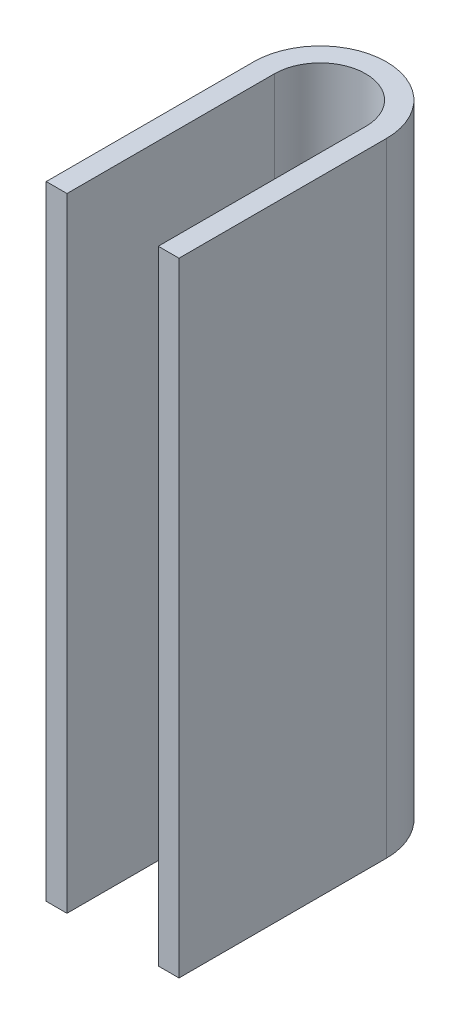
ISO-10303-21;
HEADER;
FILE_DESCRIPTION(('STEP AP214'),'2;1');
FILE_NAME('part.step','',(''),(''),'','','');
FILE_SCHEMA(('AUTOMOTIVE_DESIGN { 1 0 10303 214 1 1 1 1 }'));
ENDSEC;
DATA;
#1=APPLICATION_CONTEXT('core data for automotive mechanical design processes');
#2=APPLICATION_PROTOCOL_DEFINITION('international standard','automotive_design',2000,#1);
#3=PRODUCT_CONTEXT('',#1,'mechanical');
#4=PRODUCT('Part','Part','',(#3));
#5=PRODUCT_RELATED_PRODUCT_CATEGORY('part','',(#4));
#6=PRODUCT_DEFINITION_FORMATION('','',#4);
#7=PRODUCT_DEFINITION_CONTEXT('part definition',#1,'design');
#8=PRODUCT_DEFINITION('design','',#6,#7);
#9=PRODUCT_DEFINITION_SHAPE('','',#8);
#10=(LENGTH_UNIT() NAMED_UNIT(*) SI_UNIT(.MILLI.,.METRE.));
#11=(NAMED_UNIT(*) PLANE_ANGLE_UNIT() SI_UNIT($,.RADIAN.));
#12=(NAMED_UNIT(*) SI_UNIT($,.STERADIAN.) SOLID_ANGLE_UNIT());
#13=UNCERTAINTY_MEASURE_WITH_UNIT(LENGTH_MEASURE(1.E-05),#10,'distance_accuracy_value','');
#14=(GEOMETRIC_REPRESENTATION_CONTEXT(3) GLOBAL_UNCERTAINTY_ASSIGNED_CONTEXT((#13)) GLOBAL_UNIT_ASSIGNED_CONTEXT((#10,
#11,#12)) REPRESENTATION_CONTEXT('',''));
#15=CARTESIAN_POINT('',(0.,0.,0.));
#16=DIRECTION('',(0.,0.,1.));
#17=DIRECTION('',(1.,0.,0.));
#18=AXIS2_PLACEMENT_3D('',#15,#16,#17);
#19=CARTESIAN_POINT('',(22.,300.5,0.));
#20=DIRECTION('',(0.,-1.,0.));
#21=DIRECTION('',(0.,0.,-1.));
#22=AXIS2_PLACEMENT_3D('',#19,#20,#21);
#23=CYLINDRICAL_SURFACE('',#22,22.);
#24=CARTESIAN_POINT('',(22.,0.,0.));
#25=DIRECTION('',(0.,-1.,0.));
#26=DIRECTION('',(0.,0.,-1.));
#27=AXIS2_PLACEMENT_3D('',#24,#25,#26);
#28=CIRCLE('',#27,22.);
#29=CARTESIAN_POINT('',(0.,0.,0.));
#30=VERTEX_POINT('',#29);
#31=CARTESIAN_POINT('',(44.,0.,0.));
#32=VERTEX_POINT('',#31);
#33=EDGE_CURVE('E129',#30,#32,#28,.T.);
#34=ORIENTED_EDGE('',*,*,#33,.T.);
#35=DIRECTION('',(0.,-1.,0.));
#36=VECTOR('',#35,1.);
#37=CARTESIAN_POINT('',(44.,300.5,0.));
#38=LINE('',#37,#36);
#39=CARTESIAN_POINT('',(44.,300.5,0.));
#40=VERTEX_POINT('',#39);
#41=EDGE_CURVE('E11',#40,#32,#38,.T.);
#42=ORIENTED_EDGE('',*,*,#41,.F.);
#43=CARTESIAN_POINT('',(22.,300.5,0.));
#44=DIRECTION('',(0.,-1.,0.));
#45=DIRECTION('',(0.,0.,-1.));
#46=AXIS2_PLACEMENT_3D('',#43,#44,#45);
#47=CIRCLE('',#46,22.);
#48=CARTESIAN_POINT('',(0.,300.5,0.));
#49=VERTEX_POINT('',#48);
#50=EDGE_CURVE('E143',#49,#40,#47,.T.);
#51=ORIENTED_EDGE('',*,*,#50,.F.);
#52=DIRECTION('',(0.,-1.,0.));
#53=VECTOR('',#52,1.);
#54=CARTESIAN_POINT('',(0.,300.5,0.));
#55=LINE('',#54,#53);
#56=EDGE_CURVE('E125',#49,#30,#55,.T.);
#57=ORIENTED_EDGE('',*,*,#56,.T.);
#58=EDGE_LOOP('',(#34,#42,#51,#57));
#59=FACE_BOUND('',#58,.T.);
#60=ADVANCED_FACE('F33',(#59),#23,.F.);
#61=CARTESIAN_POINT('',(44.,300.5,0.));
#62=DIRECTION('',(1.,0.,0.));
#63=DIRECTION('',(0.,0.,-1.));
#64=AXIS2_PLACEMENT_3D('',#61,#62,#63);
#65=PLANE('',#64);
#66=DIRECTION('',(0.,0.,1.));
#67=VECTOR('',#66,1.);
#68=CARTESIAN_POINT('',(44.,0.,0.));
#69=LINE('',#68,#67);
#70=CARTESIAN_POINT('',(44.,0.,100.));
#71=VERTEX_POINT('',#70);
#72=EDGE_CURVE('E132',#32,#71,#69,.T.);
#73=ORIENTED_EDGE('',*,*,#72,.T.);
#74=DIRECTION('',(0.,-1.,0.));
#75=VECTOR('',#74,1.);
#76=CARTESIAN_POINT('',(44.,300.5,100.));
#77=LINE('',#76,#75);
#78=CARTESIAN_POINT('',(44.,300.5,100.));
#79=VERTEX_POINT('',#78);
#80=EDGE_CURVE('E41',#79,#71,#77,.T.);
#81=ORIENTED_EDGE('',*,*,#80,.F.);
#82=DIRECTION('',(0.,0.,1.));
#83=VECTOR('',#82,1.);
#84=CARTESIAN_POINT('',(44.,300.5,0.));
#85=LINE('',#84,#83);
#86=EDGE_CURVE('E92',#40,#79,#85,.T.);
#87=ORIENTED_EDGE('',*,*,#86,.F.);
#88=ORIENTED_EDGE('',*,*,#41,.T.);
#89=EDGE_LOOP('',(#73,#81,#87,#88));
#90=FACE_BOUND('',#89,.T.);
#91=ADVANCED_FACE('F178',(#90),#65,.F.);
#92=CARTESIAN_POINT('',(54.,300.5,100.));
#93=DIRECTION('',(0.,0.,-1.));
#94=DIRECTION('',(-1.,0.,0.));
#95=AXIS2_PLACEMENT_3D('',#92,#93,#94);
#96=PLANE('',#95);
#97=DIRECTION('',(1.,0.,0.));
#98=VECTOR('',#97,1.);
#99=CARTESIAN_POINT('',(54.,0.,100.));
#100=LINE('',#99,#98);
#101=CARTESIAN_POINT('',(54.,0.,100.));
#102=VERTEX_POINT('',#101);
#103=EDGE_CURVE('E134',#71,#102,#100,.T.);
#104=ORIENTED_EDGE('',*,*,#103,.T.);
#105=DIRECTION('',(0.,-1.,0.));
#106=VECTOR('',#105,1.);
#107=CARTESIAN_POINT('',(54.,300.5,100.));
#108=LINE('',#107,#106);
#109=CARTESIAN_POINT('',(54.,300.5,100.));
#110=VERTEX_POINT('',#109);
#111=EDGE_CURVE('E150',#110,#102,#108,.T.);
#112=ORIENTED_EDGE('',*,*,#111,.F.);
#113=DIRECTION('',(1.,0.,0.));
#114=VECTOR('',#113,1.);
#115=CARTESIAN_POINT('',(54.,300.5,100.));
#116=LINE('',#115,#114);
#117=EDGE_CURVE('E158',#79,#110,#116,.T.);
#118=ORIENTED_EDGE('',*,*,#117,.F.);
#119=ORIENTED_EDGE('',*,*,#80,.T.);
#120=EDGE_LOOP('',(#104,#112,#118,#119));
#121=FACE_BOUND('',#120,.T.);
#122=ADVANCED_FACE('F156',(#121),#96,.F.);
#123=CARTESIAN_POINT('',(54.,300.5,0.));
#124=DIRECTION('',(-1.,0.,0.));
#125=DIRECTION('',(0.,0.,1.));
#126=AXIS2_PLACEMENT_3D('',#123,#124,#125);
#127=PLANE('',#126);
#128=DIRECTION('',(0.,0.,-1.));
#129=VECTOR('',#128,1.);
#130=CARTESIAN_POINT('',(54.,0.,0.));
#131=LINE('',#130,#129);
#132=CARTESIAN_POINT('',(54.,0.,0.));
#133=VERTEX_POINT('',#132);
#134=EDGE_CURVE('E136',#102,#133,#131,.T.);
#135=ORIENTED_EDGE('',*,*,#134,.T.);
#136=DIRECTION('',(0.,-1.,0.));
#137=VECTOR('',#136,1.);
#138=CARTESIAN_POINT('',(54.,300.5,0.));
#139=LINE('',#138,#137);
#140=CARTESIAN_POINT('',(54.,300.5,0.));
#141=VERTEX_POINT('',#140);
#142=EDGE_CURVE('E147',#141,#133,#139,.T.);
#143=ORIENTED_EDGE('',*,*,#142,.F.);
#144=DIRECTION('',(0.,0.,-1.));
#145=VECTOR('',#144,1.);
#146=CARTESIAN_POINT('',(54.,300.5,0.));
#147=LINE('',#146,#145);
#148=EDGE_CURVE('E170',#110,#141,#147,.T.);
#149=ORIENTED_EDGE('',*,*,#148,.F.);
#150=ORIENTED_EDGE('',*,*,#111,.T.);
#151=EDGE_LOOP('',(#135,#143,#149,#150));
#152=FACE_BOUND('',#151,.T.);
#153=ADVANCED_FACE('F166',(#152),#127,.F.);
#154=CARTESIAN_POINT('',(22.,300.5,0.));
#155=DIRECTION('',(0.,-1.,0.));
#156=DIRECTION('',(0.,0.,-1.));
#157=AXIS2_PLACEMENT_3D('',#154,#155,#156);
#158=CYLINDRICAL_SURFACE('',#157,32.);
#159=CARTESIAN_POINT('',(22.,0.,0.));
#160=DIRECTION('',(0.,1.,0.));
#161=DIRECTION('',(0.,0.,-1.));
#162=AXIS2_PLACEMENT_3D('',#159,#160,#161);
#163=CIRCLE('',#162,32.);
#164=CARTESIAN_POINT('',(-10.,0.,0.));
#165=VERTEX_POINT('',#164);
#166=EDGE_CURVE('E138',#133,#165,#163,.T.);
#167=ORIENTED_EDGE('',*,*,#166,.T.);
#168=DIRECTION('',(0.,-1.,0.));
#169=VECTOR('',#168,1.);
#170=CARTESIAN_POINT('',(-10.,300.5,0.));
#171=LINE('',#170,#169);
#172=CARTESIAN_POINT('',(-10.,300.5,0.));
#173=VERTEX_POINT('',#172);
#174=EDGE_CURVE('E120',#173,#165,#171,.T.);
#175=ORIENTED_EDGE('',*,*,#174,.F.);
#176=CARTESIAN_POINT('',(22.,300.5,0.));
#177=DIRECTION('',(0.,1.,0.));
#178=DIRECTION('',(0.,0.,-1.));
#179=AXIS2_PLACEMENT_3D('',#176,#177,#178);
#180=CIRCLE('',#179,32.);
#181=EDGE_CURVE('E111',#141,#173,#180,.T.);
#182=ORIENTED_EDGE('',*,*,#181,.F.);
#183=ORIENTED_EDGE('',*,*,#142,.T.);
#184=EDGE_LOOP('',(#167,#175,#182,#183));
#185=FACE_BOUND('',#184,.T.);
#186=ADVANCED_FACE('F169',(#185),#158,.T.);
#187=CARTESIAN_POINT('',(-10.,300.5,0.));
#188=DIRECTION('',(1.,0.,0.));
#189=DIRECTION('',(0.,0.,-1.));
#190=AXIS2_PLACEMENT_3D('',#187,#188,#189);
#191=PLANE('',#190);
#192=DIRECTION('',(0.,0.,1.));
#193=VECTOR('',#192,1.);
#194=CARTESIAN_POINT('',(-10.,0.,0.));
#195=LINE('',#194,#193);
#196=CARTESIAN_POINT('',(-9.99999999999999,0.,100.));
#197=VERTEX_POINT('',#196);
#198=EDGE_CURVE('E119',#165,#197,#195,.T.);
#199=ORIENTED_EDGE('',*,*,#198,.T.);
#200=DIRECTION('',(0.,-1.,0.));
#201=VECTOR('',#200,1.);
#202=CARTESIAN_POINT('',(-9.99999999999999,300.5,100.));
#203=LINE('',#202,#201);
#204=CARTESIAN_POINT('',(-9.99999999999999,300.5,100.));
#205=VERTEX_POINT('',#204);
#206=EDGE_CURVE('E116',#205,#197,#203,.T.);
#207=ORIENTED_EDGE('',*,*,#206,.F.);
#208=DIRECTION('',(0.,0.,1.));
#209=VECTOR('',#208,1.);
#210=CARTESIAN_POINT('',(-10.,300.5,0.));
#211=LINE('',#210,#209);
#212=EDGE_CURVE('E105',#173,#205,#211,.T.);
#213=ORIENTED_EDGE('',*,*,#212,.F.);
#214=ORIENTED_EDGE('',*,*,#174,.T.);
#215=EDGE_LOOP('',(#199,#207,#213,#214));
#216=FACE_BOUND('',#215,.T.);
#217=ADVANCED_FACE('F117',(#216),#191,.F.);
#218=CARTESIAN_POINT('',(-9.99999999999999,300.5,100.));
#219=DIRECTION('',(0.,0.,-1.));
#220=DIRECTION('',(-1.,0.,0.));
#221=AXIS2_PLACEMENT_3D('',#218,#219,#220);
#222=PLANE('',#221);
#223=DIRECTION('',(1.,0.,0.));
#224=VECTOR('',#223,1.);
#225=CARTESIAN_POINT('',(-9.99999999999999,0.,100.));
#226=LINE('',#225,#224);
#227=CARTESIAN_POINT('',(0.,0.,100.));
#228=VERTEX_POINT('',#227);
#229=EDGE_CURVE('E78',#197,#228,#226,.T.);
#230=ORIENTED_EDGE('',*,*,#229,.T.);
#231=DIRECTION('',(0.,-1.,0.));
#232=VECTOR('',#231,1.);
#233=CARTESIAN_POINT('',(0.,300.5,100.));
#234=LINE('',#233,#232);
#235=CARTESIAN_POINT('',(0.,300.5,100.));
#236=VERTEX_POINT('',#235);
#237=EDGE_CURVE('E121',#236,#228,#234,.T.);
#238=ORIENTED_EDGE('',*,*,#237,.F.);
#239=DIRECTION('',(1.,0.,0.));
#240=VECTOR('',#239,1.);
#241=CARTESIAN_POINT('',(-9.99999999999999,300.5,100.));
#242=LINE('',#241,#240);
#243=EDGE_CURVE('E109',#205,#236,#242,.T.);
#244=ORIENTED_EDGE('',*,*,#243,.F.);
#245=ORIENTED_EDGE('',*,*,#206,.T.);
#246=EDGE_LOOP('',(#230,#238,#244,#245));
#247=FACE_BOUND('',#246,.T.);
#248=ADVANCED_FACE('F123',(#247),#222,.F.);
#249=CARTESIAN_POINT('',(0.,300.5,0.));
#250=DIRECTION('',(-1.,0.,0.));
#251=DIRECTION('',(0.,0.,1.));
#252=AXIS2_PLACEMENT_3D('',#249,#250,#251);
#253=PLANE('',#252);
#254=DIRECTION('',(0.,0.,-1.));
#255=VECTOR('',#254,1.);
#256=CARTESIAN_POINT('',(0.,0.,0.));
#257=LINE('',#256,#255);
#258=EDGE_CURVE('E84',#228,#30,#257,.T.);
#259=ORIENTED_EDGE('',*,*,#258,.T.);
#260=ORIENTED_EDGE('',*,*,#56,.F.);
#261=DIRECTION('',(0.,0.,-1.));
#262=VECTOR('',#261,1.);
#263=CARTESIAN_POINT('',(0.,300.5,0.));
#264=LINE('',#263,#262);
#265=EDGE_CURVE('E49',#236,#49,#264,.T.);
#266=ORIENTED_EDGE('',*,*,#265,.F.);
#267=ORIENTED_EDGE('',*,*,#237,.T.);
#268=EDGE_LOOP('',(#259,#260,#266,#267));
#269=FACE_BOUND('',#268,.T.);
#270=ADVANCED_FACE('F194',(#269),#253,.F.);
#271=CARTESIAN_POINT('',(22.,300.5,0.));
#272=DIRECTION('',(0.,-1.,0.));
#273=DIRECTION('',(0.,0.,-1.));
#274=AXIS2_PLACEMENT_3D('',#271,#272,#273);
#275=PLANE('',#274);
#276=ORIENTED_EDGE('',*,*,#50,.T.);
#277=ORIENTED_EDGE('',*,*,#86,.T.);
#278=ORIENTED_EDGE('',*,*,#117,.T.);
#279=ORIENTED_EDGE('',*,*,#148,.T.);
#280=ORIENTED_EDGE('',*,*,#181,.T.);
#281=ORIENTED_EDGE('',*,*,#212,.T.);
#282=ORIENTED_EDGE('',*,*,#243,.T.);
#283=ORIENTED_EDGE('',*,*,#265,.T.);
#284=EDGE_LOOP('',(#276,#277,#278,#279,#280,#281,#282,#283));
#285=FACE_BOUND('',#284,.T.);
#286=ADVANCED_FACE('F107',(#285),#275,.F.);
#287=CARTESIAN_POINT('',(22.,0.,0.));
#288=DIRECTION('',(0.,-1.,0.));
#289=DIRECTION('',(0.,0.,-1.));
#290=AXIS2_PLACEMENT_3D('',#287,#288,#289);
#291=PLANE('',#290);
#292=ORIENTED_EDGE('',*,*,#33,.F.);
#293=ORIENTED_EDGE('',*,*,#258,.F.);
#294=ORIENTED_EDGE('',*,*,#229,.F.);
#295=ORIENTED_EDGE('',*,*,#198,.F.);
#296=ORIENTED_EDGE('',*,*,#166,.F.);
#297=ORIENTED_EDGE('',*,*,#134,.F.);
#298=ORIENTED_EDGE('',*,*,#103,.F.);
#299=ORIENTED_EDGE('',*,*,#72,.F.);
#300=EDGE_LOOP('',(#292,#293,#294,#295,#296,#297,#298,#299));
#301=FACE_BOUND('',#300,.T.);
#302=ADVANCED_FACE('F162',(#301),#291,.T.);
#303=CLOSED_SHELL('',(#60,#91,#122,#153,#186,#217,#248,#270,#286,#302));
#304=MANIFOLD_SOLID_BREP('B2',#303);
#305=ADVANCED_BREP_SHAPE_REPRESENTATION('',(#18,#304),#14);
#306=SHAPE_DEFINITION_REPRESENTATION(#9,#305);
ENDSEC;
END-ISO-10303-21;
